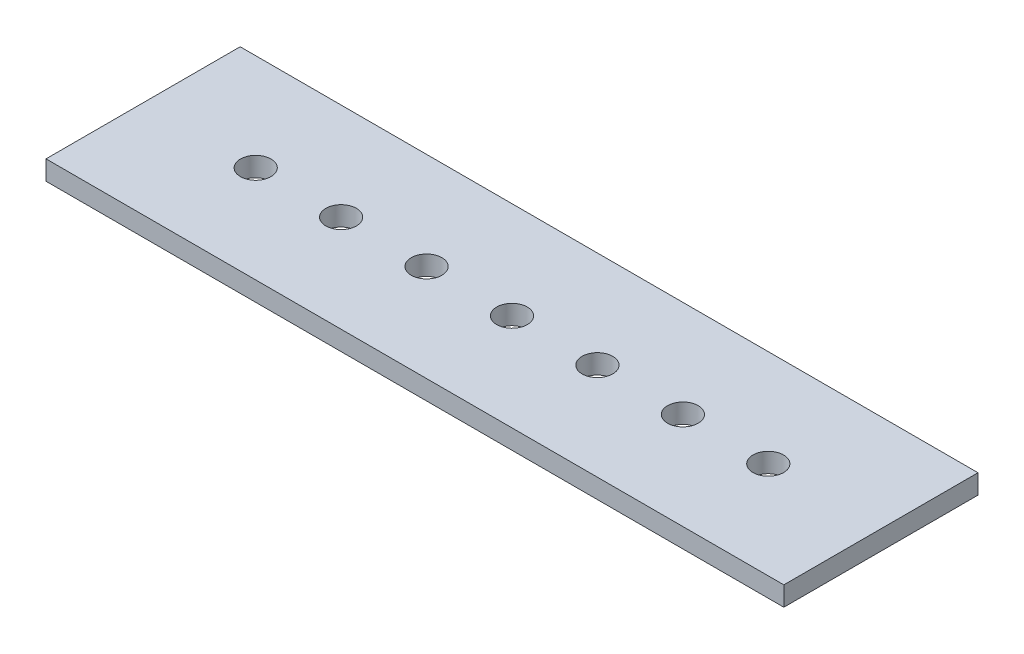
ISO-10303-21;
HEADER;
FILE_DESCRIPTION(('STEP AP214'),'2;1');
FILE_NAME('part.step','',(''),(''),'','','');
FILE_SCHEMA(('AUTOMOTIVE_DESIGN { 1 0 10303 214 1 1 1 1 }'));
ENDSEC;
DATA;
#1=APPLICATION_CONTEXT('core data for automotive mechanical design processes');
#2=APPLICATION_PROTOCOL_DEFINITION('international standard','automotive_design',2000,#1);
#3=PRODUCT_CONTEXT('',#1,'mechanical');
#4=PRODUCT('Part','Part','',(#3));
#5=PRODUCT_RELATED_PRODUCT_CATEGORY('part','',(#4));
#6=PRODUCT_DEFINITION_FORMATION('','',#4);
#7=PRODUCT_DEFINITION_CONTEXT('part definition',#1,'design');
#8=PRODUCT_DEFINITION('design','',#6,#7);
#9=PRODUCT_DEFINITION_SHAPE('','',#8);
#10=(LENGTH_UNIT() NAMED_UNIT(*) SI_UNIT(.MILLI.,.METRE.));
#11=(NAMED_UNIT(*) PLANE_ANGLE_UNIT() SI_UNIT($,.RADIAN.));
#12=(NAMED_UNIT(*) SI_UNIT($,.STERADIAN.) SOLID_ANGLE_UNIT());
#13=UNCERTAINTY_MEASURE_WITH_UNIT(LENGTH_MEASURE(1.E-05),#10,'distance_accuracy_value','');
#14=(GEOMETRIC_REPRESENTATION_CONTEXT(3) GLOBAL_UNCERTAINTY_ASSIGNED_CONTEXT((#13)) GLOBAL_UNIT_ASSIGNED_CONTEXT((#10,
#11,#12)) REPRESENTATION_CONTEXT('',''));
#15=CARTESIAN_POINT('',(0.,0.,0.));
#16=DIRECTION('',(0.,0.,1.));
#17=DIRECTION('',(1.,0.,0.));
#18=AXIS2_PLACEMENT_3D('',#15,#16,#17);
#19=CARTESIAN_POINT('',(0.,3.175,0.));
#20=DIRECTION('',(1.,0.,0.));
#21=DIRECTION('',(0.,0.,-1.));
#22=AXIS2_PLACEMENT_3D('',#19,#20,#21);
#23=PLANE('',#22);
#24=DIRECTION('',(0.,0.,1.));
#25=VECTOR('',#24,1.);
#26=CARTESIAN_POINT('',(0.,0.,0.));
#27=LINE('',#26,#25);
#28=CARTESIAN_POINT('',(0.,0.,-31.75));
#29=VERTEX_POINT('',#28);
#30=CARTESIAN_POINT('',(0.,0.,0.));
#31=VERTEX_POINT('',#30);
#32=EDGE_CURVE('E99',#29,#31,#27,.T.);
#33=ORIENTED_EDGE('',*,*,#32,.T.);
#34=DIRECTION('',(0.,-1.,0.));
#35=VECTOR('',#34,1.);
#36=CARTESIAN_POINT('',(0.,3.175,0.));
#37=LINE('',#36,#35);
#38=CARTESIAN_POINT('',(0.,3.175,0.));
#39=VERTEX_POINT('',#38);
#40=EDGE_CURVE('E11',#39,#31,#37,.T.);
#41=ORIENTED_EDGE('',*,*,#40,.F.);
#42=DIRECTION('',(0.,0.,1.));
#43=VECTOR('',#42,1.);
#44=CARTESIAN_POINT('',(0.,3.175,0.));
#45=LINE('',#44,#43);
#46=CARTESIAN_POINT('',(0.,3.175,-31.75));
#47=VERTEX_POINT('',#46);
#48=EDGE_CURVE('E86',#47,#39,#45,.T.);
#49=ORIENTED_EDGE('',*,*,#48,.F.);
#50=DIRECTION('',(0.,-1.,0.));
#51=VECTOR('',#50,1.);
#52=CARTESIAN_POINT('',(0.,3.175,-31.75));
#53=LINE('',#52,#51);
#54=EDGE_CURVE('E95',#47,#29,#53,.T.);
#55=ORIENTED_EDGE('',*,*,#54,.T.);
#56=EDGE_LOOP('',(#33,#41,#49,#55));
#57=FACE_BOUND('',#56,.T.);
#58=ADVANCED_FACE('F33',(#57),#23,.F.);
#59=CARTESIAN_POINT('',(0.,3.175,0.));
#60=DIRECTION('',(0.,0.,-1.));
#61=DIRECTION('',(-1.,0.,0.));
#62=AXIS2_PLACEMENT_3D('',#59,#60,#61);
#63=PLANE('',#62);
#64=DIRECTION('',(1.,0.,0.));
#65=VECTOR('',#64,1.);
#66=CARTESIAN_POINT('',(0.,0.,0.));
#67=LINE('',#66,#65);
#68=CARTESIAN_POINT('',(120.65,0.,0.));
#69=VERTEX_POINT('',#68);
#70=EDGE_CURVE('E90',#31,#69,#67,.T.);
#71=ORIENTED_EDGE('',*,*,#70,.T.);
#72=DIRECTION('',(0.,-1.,0.));
#73=VECTOR('',#72,1.);
#74=CARTESIAN_POINT('',(120.65,3.175,0.));
#75=LINE('',#74,#73);
#76=CARTESIAN_POINT('',(120.65,3.175,0.));
#77=VERTEX_POINT('',#76);
#78=EDGE_CURVE('E42',#77,#69,#75,.T.);
#79=ORIENTED_EDGE('',*,*,#78,.F.);
#80=DIRECTION('',(1.,0.,0.));
#81=VECTOR('',#80,1.);
#82=CARTESIAN_POINT('',(0.,3.175,0.));
#83=LINE('',#82,#81);
#84=EDGE_CURVE('E81',#39,#77,#83,.T.);
#85=ORIENTED_EDGE('',*,*,#84,.F.);
#86=ORIENTED_EDGE('',*,*,#40,.T.);
#87=EDGE_LOOP('',(#71,#79,#85,#86));
#88=FACE_BOUND('',#87,.T.);
#89=ADVANCED_FACE('F89',(#88),#63,.F.);
#90=CARTESIAN_POINT('',(120.65,3.175,0.));
#91=DIRECTION('',(-1.,0.,0.));
#92=DIRECTION('',(0.,0.,1.));
#93=AXIS2_PLACEMENT_3D('',#90,#91,#92);
#94=PLANE('',#93);
#95=DIRECTION('',(0.,0.,-1.));
#96=VECTOR('',#95,1.);
#97=CARTESIAN_POINT('',(120.65,0.,0.));
#98=LINE('',#97,#96);
#99=CARTESIAN_POINT('',(120.65,0.,-31.75));
#100=VERTEX_POINT('',#99);
#101=EDGE_CURVE('E68',#69,#100,#98,.T.);
#102=ORIENTED_EDGE('',*,*,#101,.T.);
#103=DIRECTION('',(0.,-1.,0.));
#104=VECTOR('',#103,1.);
#105=CARTESIAN_POINT('',(120.65,3.175,-31.75));
#106=LINE('',#105,#104);
#107=CARTESIAN_POINT('',(120.65,3.175,-31.75));
#108=VERTEX_POINT('',#107);
#109=EDGE_CURVE('E91',#108,#100,#106,.T.);
#110=ORIENTED_EDGE('',*,*,#109,.F.);
#111=DIRECTION('',(0.,0.,-1.));
#112=VECTOR('',#111,1.);
#113=CARTESIAN_POINT('',(120.65,3.175,0.));
#114=LINE('',#113,#112);
#115=EDGE_CURVE('E84',#77,#108,#114,.T.);
#116=ORIENTED_EDGE('',*,*,#115,.F.);
#117=ORIENTED_EDGE('',*,*,#78,.T.);
#118=EDGE_LOOP('',(#102,#110,#116,#117));
#119=FACE_BOUND('',#118,.T.);
#120=ADVANCED_FACE('F93',(#119),#94,.F.);
#121=CARTESIAN_POINT('',(0.,3.175,-31.75));
#122=DIRECTION('',(0.,0.,1.));
#123=DIRECTION('',(1.,0.,0.));
#124=AXIS2_PLACEMENT_3D('',#121,#122,#123);
#125=PLANE('',#124);
#126=DIRECTION('',(-1.,0.,0.));
#127=VECTOR('',#126,1.);
#128=CARTESIAN_POINT('',(0.,0.,-31.75));
#129=LINE('',#128,#127);
#130=EDGE_CURVE('E74',#100,#29,#129,.T.);
#131=ORIENTED_EDGE('',*,*,#130,.T.);
#132=ORIENTED_EDGE('',*,*,#54,.F.);
#133=DIRECTION('',(-1.,0.,0.));
#134=VECTOR('',#133,1.);
#135=CARTESIAN_POINT('',(0.,3.175,-31.75));
#136=LINE('',#135,#134);
#137=EDGE_CURVE('E51',#108,#47,#136,.T.);
#138=ORIENTED_EDGE('',*,*,#137,.F.);
#139=ORIENTED_EDGE('',*,*,#109,.T.);
#140=EDGE_LOOP('',(#131,#132,#138,#139));
#141=FACE_BOUND('',#140,.T.);
#142=ADVANCED_FACE('F154',(#141),#125,.F.);
#143=CARTESIAN_POINT('',(0.,3.175,0.));
#144=DIRECTION('',(0.,-1.,0.));
#145=DIRECTION('',(0.,0.,-1.));
#146=AXIS2_PLACEMENT_3D('',#143,#144,#145);
#147=PLANE('',#146);
#148=CARTESIAN_POINT('',(102.235,3.175,-15.875));
#149=DIRECTION('',(0.,1.,0.));
#150=DIRECTION('',(0.,0.,1.));
#151=AXIS2_PLACEMENT_3D('',#148,#149,#150);
#152=CIRCLE('',#151,2.5);
#153=CARTESIAN_POINT('',(102.235,3.175,-13.375));
#154=VERTEX_POINT('',#153);
#155=EDGE_CURVE('E138',#154,#154,#152,.T.);
#156=ORIENTED_EDGE('',*,*,#155,.F.);
#157=EDGE_LOOP('',(#156));
#158=FACE_BOUND('',#157,.T.);
#159=CARTESIAN_POINT('',(88.265,3.175,-15.875));
#160=DIRECTION('',(0.,1.,0.));
#161=DIRECTION('',(0.,0.,1.));
#162=AXIS2_PLACEMENT_3D('',#159,#160,#161);
#163=CIRCLE('',#162,2.5);
#164=CARTESIAN_POINT('',(88.265,3.175,-13.375));
#165=VERTEX_POINT('',#164);
#166=EDGE_CURVE('E128',#165,#165,#163,.T.);
#167=ORIENTED_EDGE('',*,*,#166,.F.);
#168=EDGE_LOOP('',(#167));
#169=FACE_BOUND('',#168,.T.);
#170=CARTESIAN_POINT('',(74.295,3.175,-15.875));
#171=DIRECTION('',(0.,1.,0.));
#172=DIRECTION('',(0.,0.,1.));
#173=AXIS2_PLACEMENT_3D('',#170,#171,#172);
#174=CIRCLE('',#173,2.5);
#175=CARTESIAN_POINT('',(74.295,3.175,-13.375));
#176=VERTEX_POINT('',#175);
#177=EDGE_CURVE('E125',#176,#176,#174,.T.);
#178=ORIENTED_EDGE('',*,*,#177,.F.);
#179=EDGE_LOOP('',(#178));
#180=FACE_BOUND('',#179,.T.);
#181=CARTESIAN_POINT('',(18.415,3.175,-15.875));
#182=DIRECTION('',(0.,1.,0.));
#183=DIRECTION('',(0.,0.,1.));
#184=AXIS2_PLACEMENT_3D('',#181,#182,#183);
#185=CIRCLE('',#184,2.5);
#186=CARTESIAN_POINT('',(18.415,3.175,-13.375));
#187=VERTEX_POINT('',#186);
#188=EDGE_CURVE('E122',#187,#187,#185,.T.);
#189=ORIENTED_EDGE('',*,*,#188,.F.);
#190=EDGE_LOOP('',(#189));
#191=FACE_BOUND('',#190,.T.);
#192=CARTESIAN_POINT('',(32.385,3.175,-15.875));
#193=DIRECTION('',(0.,1.,0.));
#194=DIRECTION('',(0.,0.,1.));
#195=AXIS2_PLACEMENT_3D('',#192,#193,#194);
#196=CIRCLE('',#195,2.5);
#197=CARTESIAN_POINT('',(32.385,3.175,-13.375));
#198=VERTEX_POINT('',#197);
#199=EDGE_CURVE('E118',#198,#198,#196,.T.);
#200=ORIENTED_EDGE('',*,*,#199,.F.);
#201=EDGE_LOOP('',(#200));
#202=FACE_BOUND('',#201,.T.);
#203=CARTESIAN_POINT('',(46.355,3.175,-15.875));
#204=DIRECTION('',(0.,1.,0.));
#205=DIRECTION('',(0.,0.,1.));
#206=AXIS2_PLACEMENT_3D('',#203,#204,#205);
#207=CIRCLE('',#206,2.5);
#208=CARTESIAN_POINT('',(46.355,3.175,-13.375));
#209=VERTEX_POINT('',#208);
#210=EDGE_CURVE('E114',#209,#209,#207,.T.);
#211=ORIENTED_EDGE('',*,*,#210,.F.);
#212=EDGE_LOOP('',(#211));
#213=FACE_BOUND('',#212,.T.);
#214=CARTESIAN_POINT('',(60.325,3.175,-15.875));
#215=DIRECTION('',(0.,1.,0.));
#216=DIRECTION('',(0.,0.,1.));
#217=AXIS2_PLACEMENT_3D('',#214,#215,#216);
#218=CIRCLE('',#217,2.5);
#219=CARTESIAN_POINT('',(60.325,3.175,-13.375));
#220=VERTEX_POINT('',#219);
#221=EDGE_CURVE('E110',#220,#220,#218,.T.);
#222=ORIENTED_EDGE('',*,*,#221,.F.);
#223=EDGE_LOOP('',(#222));
#224=FACE_BOUND('',#223,.T.);
#225=ORIENTED_EDGE('',*,*,#48,.T.);
#226=ORIENTED_EDGE('',*,*,#84,.T.);
#227=ORIENTED_EDGE('',*,*,#115,.T.);
#228=ORIENTED_EDGE('',*,*,#137,.T.);
#229=EDGE_LOOP('',(#225,#226,#227,#228));
#230=FACE_BOUND('',#229,.T.);
#231=ADVANCED_FACE('F82',(#158,#169,#180,#191,#202,#213,#224,#230),#147,.F.);
#232=CARTESIAN_POINT('',(0.,0.,0.));
#233=DIRECTION('',(0.,-1.,0.));
#234=DIRECTION('',(0.,0.,-1.));
#235=AXIS2_PLACEMENT_3D('',#232,#233,#234);
#236=PLANE('',#235);
#237=CARTESIAN_POINT('',(102.235,0.,-15.875));
#238=DIRECTION('',(0.,-1.,0.));
#239=DIRECTION('',(0.,0.,-1.));
#240=AXIS2_PLACEMENT_3D('',#237,#238,#239);
#241=CIRCLE('',#240,2.5);
#242=CARTESIAN_POINT('',(102.235,0.,-18.375));
#243=VERTEX_POINT('',#242);
#244=EDGE_CURVE('E36',#243,#243,#241,.T.);
#245=ORIENTED_EDGE('',*,*,#244,.F.);
#246=EDGE_LOOP('',(#245));
#247=FACE_BOUND('',#246,.T.);
#248=CARTESIAN_POINT('',(88.265,0.,-15.875));
#249=DIRECTION('',(0.,-1.,0.));
#250=DIRECTION('',(0.,0.,-1.));
#251=AXIS2_PLACEMENT_3D('',#248,#249,#250);
#252=CIRCLE('',#251,2.5);
#253=CARTESIAN_POINT('',(88.265,0.,-18.375));
#254=VERTEX_POINT('',#253);
#255=EDGE_CURVE('E126',#254,#254,#252,.T.);
#256=ORIENTED_EDGE('',*,*,#255,.F.);
#257=EDGE_LOOP('',(#256));
#258=FACE_BOUND('',#257,.T.);
#259=CARTESIAN_POINT('',(74.295,0.,-15.875));
#260=DIRECTION('',(0.,-1.,0.));
#261=DIRECTION('',(0.,0.,-1.));
#262=AXIS2_PLACEMENT_3D('',#259,#260,#261);
#263=CIRCLE('',#262,2.5);
#264=CARTESIAN_POINT('',(74.295,0.,-18.375));
#265=VERTEX_POINT('',#264);
#266=EDGE_CURVE('E123',#265,#265,#263,.T.);
#267=ORIENTED_EDGE('',*,*,#266,.F.);
#268=EDGE_LOOP('',(#267));
#269=FACE_BOUND('',#268,.T.);
#270=CARTESIAN_POINT('',(18.415,0.,-15.875));
#271=DIRECTION('',(0.,-1.,0.));
#272=DIRECTION('',(0.,0.,-1.));
#273=AXIS2_PLACEMENT_3D('',#270,#271,#272);
#274=CIRCLE('',#273,2.5);
#275=CARTESIAN_POINT('',(18.415,0.,-18.375));
#276=VERTEX_POINT('',#275);
#277=EDGE_CURVE('E119',#276,#276,#274,.T.);
#278=ORIENTED_EDGE('',*,*,#277,.F.);
#279=EDGE_LOOP('',(#278));
#280=FACE_BOUND('',#279,.T.);
#281=CARTESIAN_POINT('',(32.385,0.,-15.875));
#282=DIRECTION('',(0.,-1.,0.));
#283=DIRECTION('',(0.,0.,-1.));
#284=AXIS2_PLACEMENT_3D('',#281,#282,#283);
#285=CIRCLE('',#284,2.5);
#286=CARTESIAN_POINT('',(32.385,0.,-18.375));
#287=VERTEX_POINT('',#286);
#288=EDGE_CURVE('E115',#287,#287,#285,.T.);
#289=ORIENTED_EDGE('',*,*,#288,.F.);
#290=EDGE_LOOP('',(#289));
#291=FACE_BOUND('',#290,.T.);
#292=CARTESIAN_POINT('',(46.355,0.,-15.875));
#293=DIRECTION('',(0.,-1.,0.));
#294=DIRECTION('',(0.,0.,-1.));
#295=AXIS2_PLACEMENT_3D('',#292,#293,#294);
#296=CIRCLE('',#295,2.5);
#297=CARTESIAN_POINT('',(46.355,0.,-18.375));
#298=VERTEX_POINT('',#297);
#299=EDGE_CURVE('E111',#298,#298,#296,.T.);
#300=ORIENTED_EDGE('',*,*,#299,.F.);
#301=EDGE_LOOP('',(#300));
#302=FACE_BOUND('',#301,.T.);
#303=CARTESIAN_POINT('',(60.325,0.,-15.875));
#304=DIRECTION('',(0.,-1.,0.));
#305=DIRECTION('',(0.,0.,-1.));
#306=AXIS2_PLACEMENT_3D('',#303,#304,#305);
#307=CIRCLE('',#306,2.5);
#308=CARTESIAN_POINT('',(60.325,0.,-18.375));
#309=VERTEX_POINT('',#308);
#310=EDGE_CURVE('E102',#309,#309,#307,.T.);
#311=ORIENTED_EDGE('',*,*,#310,.F.);
#312=EDGE_LOOP('',(#311));
#313=FACE_BOUND('',#312,.T.);
#314=ORIENTED_EDGE('',*,*,#32,.F.);
#315=ORIENTED_EDGE('',*,*,#130,.F.);
#316=ORIENTED_EDGE('',*,*,#101,.F.);
#317=ORIENTED_EDGE('',*,*,#70,.F.);
#318=EDGE_LOOP('',(#314,#315,#316,#317));
#319=FACE_BOUND('',#318,.T.);
#320=ADVANCED_FACE('F153',(#247,#258,#269,#280,#291,#302,#313,#319),#236,.T.);
#321=CARTESIAN_POINT('',(60.325,-1.905,-15.875));
#322=DIRECTION('',(0.,1.,0.));
#323=DIRECTION('',(0.,0.,1.));
#324=AXIS2_PLACEMENT_3D('',#321,#322,#323);
#325=CYLINDRICAL_SURFACE('',#324,2.5);
#326=ORIENTED_EDGE('',*,*,#310,.T.);
#327=EDGE_LOOP('',(#326));
#328=FACE_BOUND('',#327,.T.);
#329=ORIENTED_EDGE('',*,*,#221,.T.);
#330=EDGE_LOOP('',(#329));
#331=FACE_BOUND('',#330,.T.);
#332=ADVANCED_FACE('F150',(#328,#331),#325,.F.);
#333=CARTESIAN_POINT('',(46.355,-1.905,-15.875));
#334=DIRECTION('',(0.,1.,0.));
#335=DIRECTION('',(0.,0.,1.));
#336=AXIS2_PLACEMENT_3D('',#333,#334,#335);
#337=CYLINDRICAL_SURFACE('',#336,2.5);
#338=ORIENTED_EDGE('',*,*,#299,.T.);
#339=EDGE_LOOP('',(#338));
#340=FACE_BOUND('',#339,.T.);
#341=ORIENTED_EDGE('',*,*,#210,.T.);
#342=EDGE_LOOP('',(#341));
#343=FACE_BOUND('',#342,.T.);
#344=ADVANCED_FACE('F202',(#340,#343),#337,.F.);
#345=CARTESIAN_POINT('',(32.385,-1.905,-15.875));
#346=DIRECTION('',(0.,1.,0.));
#347=DIRECTION('',(0.,0.,1.));
#348=AXIS2_PLACEMENT_3D('',#345,#346,#347);
#349=CYLINDRICAL_SURFACE('',#348,2.5);
#350=ORIENTED_EDGE('',*,*,#288,.T.);
#351=EDGE_LOOP('',(#350));
#352=FACE_BOUND('',#351,.T.);
#353=ORIENTED_EDGE('',*,*,#199,.T.);
#354=EDGE_LOOP('',(#353));
#355=FACE_BOUND('',#354,.T.);
#356=ADVANCED_FACE('F207',(#352,#355),#349,.F.);
#357=CARTESIAN_POINT('',(18.415,-1.905,-15.875));
#358=DIRECTION('',(0.,1.,0.));
#359=DIRECTION('',(0.,0.,1.));
#360=AXIS2_PLACEMENT_3D('',#357,#358,#359);
#361=CYLINDRICAL_SURFACE('',#360,2.5);
#362=ORIENTED_EDGE('',*,*,#277,.T.);
#363=EDGE_LOOP('',(#362));
#364=FACE_BOUND('',#363,.T.);
#365=ORIENTED_EDGE('',*,*,#188,.T.);
#366=EDGE_LOOP('',(#365));
#367=FACE_BOUND('',#366,.T.);
#368=ADVANCED_FACE('F215',(#364,#367),#361,.F.);
#369=CARTESIAN_POINT('',(74.295,-1.905,-15.875));
#370=DIRECTION('',(0.,1.,0.));
#371=DIRECTION('',(0.,0.,1.));
#372=AXIS2_PLACEMENT_3D('',#369,#370,#371);
#373=CYLINDRICAL_SURFACE('',#372,2.5);
#374=ORIENTED_EDGE('',*,*,#266,.T.);
#375=EDGE_LOOP('',(#374));
#376=FACE_BOUND('',#375,.T.);
#377=ORIENTED_EDGE('',*,*,#177,.T.);
#378=EDGE_LOOP('',(#377));
#379=FACE_BOUND('',#378,.T.);
#380=ADVANCED_FACE('F223',(#376,#379),#373,.F.);
#381=CARTESIAN_POINT('',(88.265,-1.905,-15.875));
#382=DIRECTION('',(0.,1.,0.));
#383=DIRECTION('',(0.,0.,1.));
#384=AXIS2_PLACEMENT_3D('',#381,#382,#383);
#385=CYLINDRICAL_SURFACE('',#384,2.5);
#386=ORIENTED_EDGE('',*,*,#255,.T.);
#387=EDGE_LOOP('',(#386));
#388=FACE_BOUND('',#387,.T.);
#389=ORIENTED_EDGE('',*,*,#166,.T.);
#390=EDGE_LOOP('',(#389));
#391=FACE_BOUND('',#390,.T.);
#392=ADVANCED_FACE('F231',(#388,#391),#385,.F.);
#393=CARTESIAN_POINT('',(102.235,-1.905,-15.875));
#394=DIRECTION('',(0.,1.,0.));
#395=DIRECTION('',(0.,0.,1.));
#396=AXIS2_PLACEMENT_3D('',#393,#394,#395);
#397=CYLINDRICAL_SURFACE('',#396,2.5);
#398=ORIENTED_EDGE('',*,*,#244,.T.);
#399=EDGE_LOOP('',(#398));
#400=FACE_BOUND('',#399,.T.);
#401=ORIENTED_EDGE('',*,*,#155,.T.);
#402=EDGE_LOOP('',(#401));
#403=FACE_BOUND('',#402,.T.);
#404=ADVANCED_FACE('F239',(#400,#403),#397,.F.);
#405=CLOSED_SHELL('',(#58,#89,#120,#142,#231,#320,#332,#344,#356,#368,#380,#392,#404));
#406=MANIFOLD_SOLID_BREP('B2',#405);
#407=ADVANCED_BREP_SHAPE_REPRESENTATION('',(#18,#406),#14);
#408=SHAPE_DEFINITION_REPRESENTATION(#9,#407);
ENDSEC;
END-ISO-10303-21;
